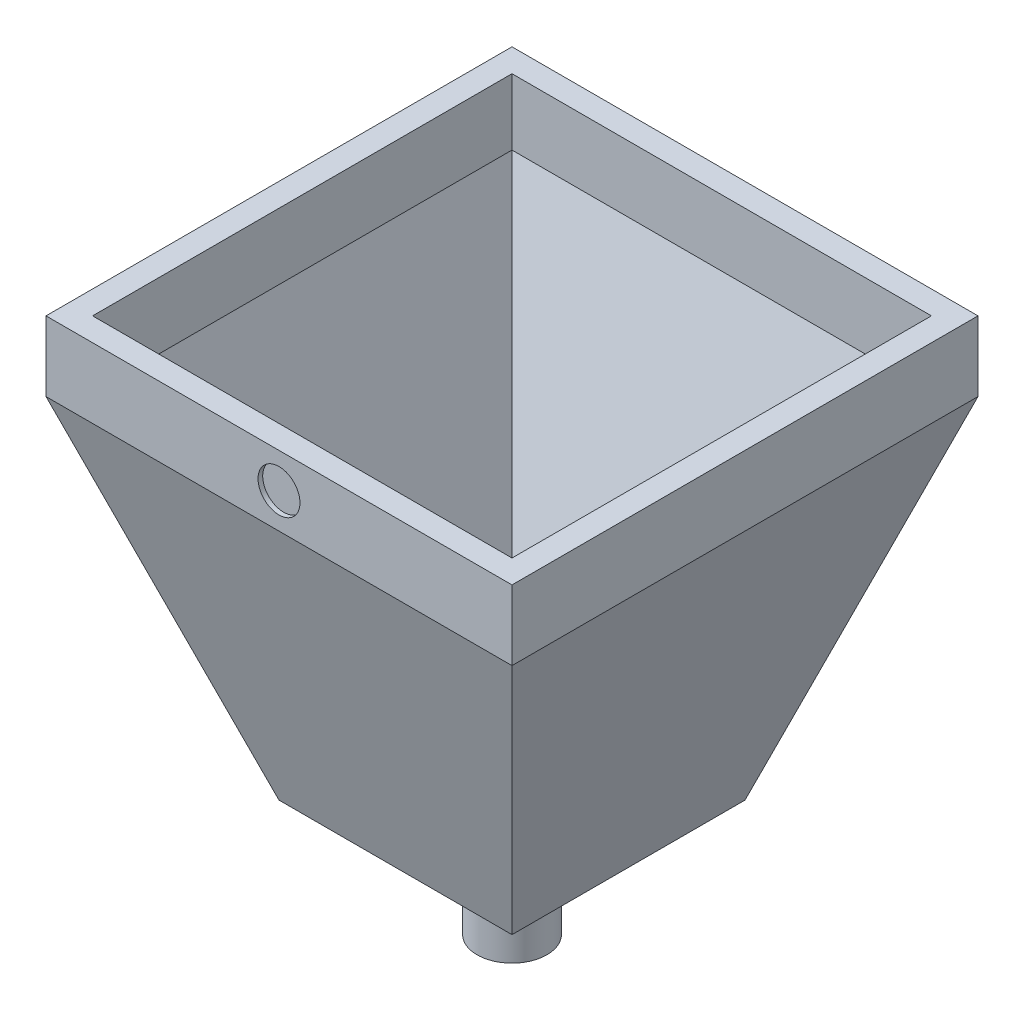
ISO-10303-21;
HEADER;
FILE_DESCRIPTION(('STEP AP214'),'2;1');
FILE_NAME('part.step','',(''),(''),'','','');
FILE_SCHEMA(('AUTOMOTIVE_DESIGN { 1 0 10303 214 1 1 1 1 }'));
ENDSEC;
DATA;
#1=APPLICATION_CONTEXT('core data for automotive mechanical design processes');
#2=APPLICATION_PROTOCOL_DEFINITION('international standard','automotive_design',2000,#1);
#3=PRODUCT_CONTEXT('',#1,'mechanical');
#4=PRODUCT('Part','Part','',(#3));
#5=PRODUCT_RELATED_PRODUCT_CATEGORY('part','',(#4));
#6=PRODUCT_DEFINITION_FORMATION('','',#4);
#7=PRODUCT_DEFINITION_CONTEXT('part definition',#1,'design');
#8=PRODUCT_DEFINITION('design','',#6,#7);
#9=PRODUCT_DEFINITION_SHAPE('','',#8);
#10=(LENGTH_UNIT() NAMED_UNIT(*) SI_UNIT(.MILLI.,.METRE.));
#11=(NAMED_UNIT(*) PLANE_ANGLE_UNIT() SI_UNIT($,.RADIAN.));
#12=(NAMED_UNIT(*) SI_UNIT($,.STERADIAN.) SOLID_ANGLE_UNIT());
#13=UNCERTAINTY_MEASURE_WITH_UNIT(LENGTH_MEASURE(1.E-05),#10,'distance_accuracy_value','');
#14=(GEOMETRIC_REPRESENTATION_CONTEXT(3) GLOBAL_UNCERTAINTY_ASSIGNED_CONTEXT((#13)) GLOBAL_UNIT_ASSIGNED_CONTEXT((#10,
#11,#12)) REPRESENTATION_CONTEXT('',''));
#15=CARTESIAN_POINT('',(0.,0.,0.));
#16=DIRECTION('',(0.,0.,1.));
#17=DIRECTION('',(1.,0.,0.));
#18=AXIS2_PLACEMENT_3D('',#15,#16,#17);
#19=CARTESIAN_POINT('',(0.,-5.,0.));
#20=DIRECTION('',(0.,1.,0.));
#21=DIRECTION('',(0.,0.,1.));
#22=AXIS2_PLACEMENT_3D('',#19,#20,#21);
#23=CYLINDRICAL_SURFACE('',#22,1.5);
#24=CARTESIAN_POINT('',(0.,-5.,0.));
#25=DIRECTION('',(0.,-1.,0.));
#26=DIRECTION('',(0.,0.,-1.));
#27=AXIS2_PLACEMENT_3D('',#24,#25,#26);
#28=CIRCLE('',#27,1.5);
#29=CARTESIAN_POINT('',(0.,-5.,-1.5));
#30=VERTEX_POINT('',#29);
#31=EDGE_CURVE('E13',#30,#30,#28,.T.);
#32=ORIENTED_EDGE('',*,*,#31,.F.);
#33=EDGE_LOOP('',(#32));
#34=FACE_BOUND('',#33,.T.);
#35=CARTESIAN_POINT('',(0.,0.,0.));
#36=DIRECTION('',(0.,-1.,0.));
#37=DIRECTION('',(0.,0.,-1.));
#38=AXIS2_PLACEMENT_3D('',#35,#36,#37);
#39=CIRCLE('',#38,1.5);
#40=CARTESIAN_POINT('',(0.,0.,-1.5));
#41=VERTEX_POINT('',#40);
#42=EDGE_CURVE('E64',#41,#41,#39,.T.);
#43=ORIENTED_EDGE('',*,*,#42,.T.);
#44=EDGE_LOOP('',(#43));
#45=FACE_BOUND('',#44,.T.);
#46=CARTESIAN_POINT('',(1.5,-1.43917780015329,0.));
#47=CARTESIAN_POINT('',(1.50000020822414,-1.43917752533704,0.0502423583340641));
#48=CARTESIAN_POINT('',(1.49745401376693,-1.44298478513104,0.100484543566457));
#49=CARTESIAN_POINT('',(1.48752326211906,-1.45797623220612,0.199366529015834));
#50=CARTESIAN_POINT('',(1.48013640790618,-1.46916392171494,0.248005556977501));
#51=CARTESIAN_POINT('',(1.46125241202354,-1.49823165881571,0.342106153927126));
#52=CARTESIAN_POINT('',(1.44977452746657,-1.51608037015726,0.387581436328778));
#53=CARTESIAN_POINT('',(1.4236306893872,-1.55770948178904,0.474707645498629));
#54=CARTESIAN_POINT('',(1.40896427302755,-1.58149074330357,0.516358015804834));
#55=CARTESIAN_POINT('',(1.37613664684919,-1.636506268837,0.598642350385054));
#56=CARTESIAN_POINT('',(1.3577844878966,-1.66820173052474,0.638890152730338));
#57=CARTESIAN_POINT('',(1.31991156541733,-1.73704282448251,0.713864022346369));
#58=CARTESIAN_POINT('',(1.30038915178416,-1.77419626507216,0.748582027719439));
#59=CARTESIAN_POINT('',(1.25864132339397,-1.85970398395962,0.81711148872748));
#60=CARTESIAN_POINT('',(1.23647533968899,-1.90890062675501,0.849915931813755));
#61=CARTESIAN_POINT('',(1.19542073676408,-2.01335948897656,0.906751785070868));
#62=CARTESIAN_POINT('',(1.17652647977327,-2.06861100093468,0.930798367132495));
#63=CARTESIAN_POINT('',(1.14988133320735,-2.16753344686409,0.963370175057203));
#64=CARTESIAN_POINT('',(1.14048813946218,-2.2099420265902,0.974372236180082));
#65=CARTESIAN_POINT('',(1.12628984829786,-2.29655005252416,0.9907530889261));
#66=CARTESIAN_POINT('',(1.12147684372013,-2.34074627451648,0.996141573259661));
#67=CARTESIAN_POINT('',(1.11718302804083,-2.42991518958136,1.00095682070629));
#68=CARTESIAN_POINT('',(1.11772401279478,-2.47489031187889,1.0003592145882));
#69=CARTESIAN_POINT('',(1.12409887741485,-2.56399528690377,0.993187906666195));
#70=CARTESIAN_POINT('',(1.12993724142592,-2.6081243911696,0.986609141899784));
#71=CARTESIAN_POINT('',(1.14563592995791,-2.69241132577208,0.968324971088712));
#72=CARTESIAN_POINT('',(1.15530744165153,-2.73265846811481,0.956858557405003));
#73=CARTESIAN_POINT('',(1.17754811463845,-2.81068964564904,0.929350592909502));
#74=CARTESIAN_POINT('',(1.19011822916388,-2.84847286530192,0.913307536614355));
#75=CARTESIAN_POINT('',(1.21982098202212,-2.92869049779443,0.873369093698319));
#76=CARTESIAN_POINT('',(1.23736158924507,-2.97050775024735,0.848540261643843));
#77=CARTESIAN_POINT('',(1.27345768922483,-3.04986949764519,0.793344802336529));
#78=CARTESIAN_POINT('',(1.29201441370947,-3.08740862899042,0.762971345040338));
#79=CARTESIAN_POINT('',(1.33271671862096,-3.16544907300885,0.689905826559711));
#80=CARTESIAN_POINT('',(1.35477372355024,-3.20484482450899,0.645969691404499));
#81=CARTESIAN_POINT('',(1.39609050337857,-3.27577604740822,0.55100399955381));
#82=CARTESIAN_POINT('',(1.41535288825285,-3.30731887285433,0.499981149675163));
#83=CARTESIAN_POINT('',(1.44572702044166,-3.35591665946749,0.402428913545601));
#84=CARTESIAN_POINT('',(1.45769630582498,-3.3745994818235,0.356978821685242));
#85=CARTESIAN_POINT('',(1.47753859515521,-3.40523026296523,0.263018021968455));
#86=CARTESIAN_POINT('',(1.48541506063844,-3.4171839137192,0.214509939501018));
#87=CARTESIAN_POINT('',(1.49637941078331,-3.43375838277248,0.115492726585947));
#88=CARTESIAN_POINT('',(1.49944661230576,-3.43834753062247,0.0649759059670237));
#89=CARTESIAN_POINT('',(1.50041557482591,-3.43980134443434,-0.0362207596946167));
#90=CARTESIAN_POINT('',(1.49831769692815,-3.43666655039768,-0.0869005930932817));
#91=CARTESIAN_POINT('',(1.48949794712138,-3.42336577237231,-0.183227858602147));
#92=CARTESIAN_POINT('',(1.48311123195135,-3.41370915127563,-0.228978722339655));
#93=CARTESIAN_POINT('',(1.46659224642396,-3.38837995714691,-0.31805819621364));
#94=CARTESIAN_POINT('',(1.45645937873408,-3.37270642468939,-0.361386418785355));
#95=CARTESIAN_POINT('',(1.4324817626467,-3.33485165163061,-0.447332375233221));
#96=CARTESIAN_POINT('',(1.41844935068245,-3.31233372311153,-0.489748092316564));
#97=CARTESIAN_POINT('',(1.38800927805403,-3.26196115518099,-0.57034151197779));
#98=CARTESIAN_POINT('',(1.37160015200652,-3.23410321989032,-0.608516574097255));
#99=CARTESIAN_POINT('',(1.33477273328243,-3.16887386607092,-0.685927227415323));
#100=CARTESIAN_POINT('',(1.31413078406203,-3.13069467010127,-0.724375937862665));
#101=CARTESIAN_POINT('',(1.27285586536854,-3.04862208518922,-0.794669840332393));
#102=CARTESIAN_POINT('',(1.25222291185946,-3.00472478065389,-0.826510468230433));
#103=CARTESIAN_POINT('',(1.21469839506517,-2.91560659372409,-0.880623882794763));
#104=CARTESIAN_POINT('',(1.19763798588662,-2.87081178325343,-0.903478180804394));
#105=CARTESIAN_POINT('',(1.16719487207113,-2.77724147376272,-0.942481068876251));
#106=CARTESIAN_POINT('',(1.1538055628277,-2.72847333095559,-0.958641728453858));
#107=CARTESIAN_POINT('',(1.13466604076532,-2.63689555658624,-0.981179217293119));
#108=CARTESIAN_POINT('',(1.12797499006895,-2.59459189522382,-0.988792987823092));
#109=CARTESIAN_POINT('',(1.11939733222928,-2.50889115948557,-0.998496029624887));
#110=CARTESIAN_POINT('',(1.11750550674066,-2.46549532458006,-1.00059130142516));
#111=CARTESIAN_POINT('',(1.11882100574833,-2.37885627179493,-0.999119609907757));
#112=CARTESIAN_POINT('',(1.12203134956834,-2.33561315947183,-0.995549293852656));
#113=CARTESIAN_POINT('',(1.1330522619864,-2.25050603588181,-0.982984986109971));
#114=CARTESIAN_POINT('',(1.14086896751217,-2.2086439432229,-0.97398375858765));
#115=CARTESIAN_POINT('',(1.1626342196827,-2.11632220693897,-0.947965178356308));
#116=CARTESIAN_POINT('',(1.17766166854602,-2.06654394378376,-0.929450935941994));
#117=CARTESIAN_POINT('',(1.21111080629161,-1.97143438306388,-0.885422631474874));
#118=CARTESIAN_POINT('',(1.22953724861882,-1.92610945118486,-0.859898741785421));
#119=CARTESIAN_POINT('',(1.26808593269726,-1.83953685655645,-0.801991402694657));
#120=CARTESIAN_POINT('',(1.28823293691071,-1.79837842743403,-0.769491549448272));
#121=CARTESIAN_POINT('',(1.32814150773993,-1.72151656103206,-0.698358840177309));
#122=CARTESIAN_POINT('',(1.3479029541764,-1.68581480164088,-0.659724105134951));
#123=CARTESIAN_POINT('',(1.38815775980392,-1.61582174799623,-0.570728664877768));
#124=CARTESIAN_POINT('',(1.40834902724558,-1.58246848006346,-0.519480834775987));
#125=CARTESIAN_POINT('',(1.44388832937518,-1.5252211618213,-0.410434277887489));
#126=CARTESIAN_POINT('',(1.45924396722731,-1.50131224674147,-0.352646031225022));
#127=CARTESIAN_POINT('',(1.48050822418367,-1.46860051107127,-0.245717534917525));
#128=CARTESIAN_POINT('',(1.48775740184446,-1.45762228060395,-0.197506162628867));
#129=CARTESIAN_POINT('',(1.49750140070948,-1.44291378388427,-0.0995290060120655));
#130=CARTESIAN_POINT('',(1.49999979375663,-1.43917807235529,-0.0497644180940288));
#131=CARTESIAN_POINT('',(1.5,-1.43917780015329,0.));
#132=B_SPLINE_CURVE_WITH_KNOTS('',3,(#46,#47,#48,#49,#50,#51,#52,#53,#54,#55,#56,#57,#58,#59,
#60,#61,#62,#63,#64,#65,#66,#67,#68,#69,#70,#71,#72,#73,#74,#75,#76,#77,#78,#79,#80,#81,#82,#83,
#84,#85,#86,#87,#88,#89,#90,#91,#92,#93,#94,#95,#96,#97,#98,#99,#100,#101,#102,#103,#104,#105,
#106,#107,#108,#109,#110,#111,#112,#113,#114,#115,#116,#117,#118,#119,#120,#121,#122,#123,#124,
#125,#126,#127,#128,#129,#130,#131),.UNSPECIFIED.,.T.,.F.,(4,2,2,2,2,2,2,2,2,2,2,2,2,2,2,2,2,2,
2,2,2,2,2,2,2,2,2,2,2,2,2,2,2,2,2,2,2,2,2,2,2,2,4),(0.,0.1505266132527,0.301124707174344,
0.451023076595116,0.600943219336932,0.763585145002784,0.926462058021593,1.11503341647991,
1.30327652722719,1.43716846838015,1.57082883922904,1.70503355867689,1.83935198631676,
1.96774431099011,2.09617891902539,2.25073787329797,2.40548851889212,2.5935947724756,
2.78152420149865,2.93262043847563,3.0835886757059,3.23520441646309,3.38680955765891,
3.5277654239542,3.66874377568319,3.81826173413942,3.96787227471786,4.1411408806983,
4.31452876587063,4.473249676497,4.63168313315305,4.76162024003011,4.8914160016149,
5.02128860137217,5.15133461921144,5.31603304346011,5.48096356682587,5.64889622595852,
5.81688041978686,6.00897675773024,6.20076953274023,6.34997645676982,6.49907115623394),.UNSPECIFIED.);
#133=CARTESIAN_POINT('',(1.5,-1.43917780015329,0.));
#134=VERTEX_POINT('',#133);
#135=CARTESIAN_POINT('',(1.5,-3.43917780015329,0.));
#136=VERTEX_POINT('',#135);
#137=EDGE_CURVE('E73',#134,#136,#132,.T.);
#138=ORIENTED_EDGE('',*,*,#137,.F.);
#139=EDGE_CURVE('E71',#136,#134,#132,.T.);
#140=ORIENTED_EDGE('',*,*,#139,.F.);
#141=EDGE_LOOP('',(#138,#140));
#142=FACE_BOUND('',#141,.T.);
#143=ADVANCED_FACE('F55',(#34,#45,#142),#23,.T.);
#144=CARTESIAN_POINT('',(0.,-5.,0.));
#145=DIRECTION('',(0.,-1.,0.));
#146=DIRECTION('',(0.,0.,-1.));
#147=AXIS2_PLACEMENT_3D('',#144,#145,#146);
#148=PLANE('',#147);
#149=CARTESIAN_POINT('',(0.,-5.,0.));
#150=DIRECTION('',(0.,-1.,0.));
#151=DIRECTION('',(0.,0.,-1.));
#152=AXIS2_PLACEMENT_3D('',#149,#150,#151);
#153=CIRCLE('',#152,1.40639171905491);
#154=CARTESIAN_POINT('',(0.,-5.,-1.40639171905491));
#155=VERTEX_POINT('',#154);
#156=EDGE_CURVE('E86',#155,#155,#153,.F.);
#157=ORIENTED_EDGE('',*,*,#156,.T.);
#158=EDGE_LOOP('',(#157));
#159=FACE_BOUND('',#158,.T.);
#160=ORIENTED_EDGE('',*,*,#31,.T.);
#161=EDGE_LOOP('',(#160));
#162=FACE_BOUND('',#161,.T.);
#163=ADVANCED_FACE('F98',(#159,#162),#148,.T.);
#164=CARTESIAN_POINT('',(0.,0.,0.));
#165=DIRECTION('',(0.,-1.,0.));
#166=DIRECTION('',(0.,0.,-1.));
#167=AXIS2_PLACEMENT_3D('',#164,#165,#166);
#168=PLANE('',#167);
#169=CARTESIAN_POINT('',(0.,0.,0.));
#170=DIRECTION('',(0.,-1.,0.));
#171=DIRECTION('',(0.,0.,-1.));
#172=AXIS2_PLACEMENT_3D('',#169,#170,#171);
#173=CIRCLE('',#172,1.40639171905491);
#174=CARTESIAN_POINT('',(0.,0.,-1.40639171905491));
#175=VERTEX_POINT('',#174);
#176=EDGE_CURVE('E59',#175,#175,#173,.F.);
#177=ORIENTED_EDGE('',*,*,#176,.F.);
#178=EDGE_LOOP('',(#177));
#179=FACE_BOUND('',#178,.T.);
#180=ORIENTED_EDGE('',*,*,#42,.F.);
#181=EDGE_LOOP('',(#180));
#182=FACE_BOUND('',#181,.T.);
#183=ADVANCED_FACE('F100',(#179,#182),#168,.F.);
#184=CARTESIAN_POINT('',(1.5,-2.43917780015329,0.));
#185=DIRECTION('',(1.,0.,0.));
#186=DIRECTION('',(0.,0.,-1.));
#187=AXIS2_PLACEMENT_3D('',#184,#185,#186);
#188=PLANE('',#187);
#189=CARTESIAN_POINT('',(1.5,-2.43917780015329,0.));
#190=DIRECTION('',(1.,0.,0.));
#191=DIRECTION('',(0.,0.,-1.));
#192=AXIS2_PLACEMENT_3D('',#189,#190,#191);
#193=CIRCLE('',#192,1.);
#194=EDGE_CURVE('E81',#136,#134,#193,.T.);
#195=ORIENTED_EDGE('',*,*,#194,.T.);
#196=EDGE_CURVE('E83',#134,#136,#193,.T.);
#197=ORIENTED_EDGE('',*,*,#196,.T.);
#198=EDGE_LOOP('',(#195,#197));
#199=FACE_BOUND('',#198,.T.);
#200=ADVANCED_FACE('F85',(#199),#188,.T.);
#201=CARTESIAN_POINT('',(1.5,-2.43917780015329,0.));
#202=DIRECTION('',(-1.,0.,0.));
#203=DIRECTION('',(0.,0.,1.));
#204=AXIS2_PLACEMENT_3D('',#201,#202,#203);
#205=CYLINDRICAL_SURFACE('',#204,1.);
#206=ORIENTED_EDGE('',*,*,#196,.F.);
#207=ORIENTED_EDGE('',*,*,#137,.T.);
#208=EDGE_LOOP('',(#206,#207));
#209=FACE_BOUND('',#208,.T.);
#210=ADVANCED_FACE('F88',(#209),#205,.T.);
#211=ORIENTED_EDGE('',*,*,#194,.F.);
#212=ORIENTED_EDGE('',*,*,#139,.T.);
#213=EDGE_LOOP('',(#211,#212));
#214=FACE_BOUND('',#213,.T.);
#215=ADVANCED_FACE('F80',(#214),#205,.T.);
#216=CARTESIAN_POINT('',(0.,-31.5,0.));
#217=DIRECTION('',(0.,1.,0.));
#218=DIRECTION('',(0.,0.,1.));
#219=AXIS2_PLACEMENT_3D('',#216,#217,#218);
#220=CYLINDRICAL_SURFACE('',#219,1.40639171905491);
#221=ORIENTED_EDGE('',*,*,#156,.F.);
#222=EDGE_LOOP('',(#221));
#223=FACE_BOUND('',#222,.T.);
#224=ORIENTED_EDGE('',*,*,#176,.T.);
#225=EDGE_LOOP('',(#224));
#226=FACE_BOUND('',#225,.T.);
#227=ADVANCED_FACE('F137',(#223,#226),#220,.F.);
#228=CLOSED_SHELL('',(#143,#163,#183,#200,#210,#215,#227));
#229=MANIFOLD_SOLID_BREP('B2',#228);
#230=CARTESIAN_POINT('',(0.,0.,0.));
#231=DIRECTION('',(0.,-1.,0.));
#232=DIRECTION('',(0.,0.,-1.));
#233=AXIS2_PLACEMENT_3D('',#230,#231,#232);
#234=PLANE('',#233);
#235=CARTESIAN_POINT('',(0.,0.,0.));
#236=DIRECTION('',(0.,-1.,0.));
#237=DIRECTION('',(0.,0.,-1.));
#238=AXIS2_PLACEMENT_3D('',#235,#236,#237);
#239=CIRCLE('',#238,1.5);
#240=CARTESIAN_POINT('',(0.,0.,-1.5));
#241=VERTEX_POINT('',#240);
#242=EDGE_CURVE('E640',#241,#241,#239,.T.);
#243=ORIENTED_EDGE('',*,*,#242,.F.);
#244=EDGE_LOOP('',(#243));
#245=FACE_BOUND('',#244,.T.);
#246=DIRECTION('',(0.,0.,-1.));
#247=VECTOR('',#246,1.);
#248=CARTESIAN_POINT('',(5.,0.,5.));
#249=LINE('',#248,#247);
#250=CARTESIAN_POINT('',(5.,0.,5.));
#251=VERTEX_POINT('',#250);
#252=CARTESIAN_POINT('',(5.,0.,-5.));
#253=VERTEX_POINT('',#252);
#254=EDGE_CURVE('E396',#251,#253,#249,.T.);
#255=ORIENTED_EDGE('',*,*,#254,.F.);
#256=DIRECTION('',(1.,0.,0.));
#257=VECTOR('',#256,1.);
#258=CARTESIAN_POINT('',(-5.,0.,5.));
#259=LINE('',#258,#257);
#260=CARTESIAN_POINT('',(-5.,0.,5.));
#261=VERTEX_POINT('',#260);
#262=EDGE_CURVE('E53',#261,#251,#259,.T.);
#263=ORIENTED_EDGE('',*,*,#262,.F.);
#264=DIRECTION('',(0.,0.,1.));
#265=VECTOR('',#264,1.);
#266=CARTESIAN_POINT('',(-5.,0.,5.));
#267=LINE('',#266,#265);
#268=CARTESIAN_POINT('',(-5.,0.,-5.));
#269=VERTEX_POINT('',#268);
#270=EDGE_CURVE('E176',#269,#261,#267,.T.);
#271=ORIENTED_EDGE('',*,*,#270,.F.);
#272=DIRECTION('',(-1.,0.,0.));
#273=VECTOR('',#272,1.);
#274=CARTESIAN_POINT('',(-5.,0.,-5.));
#275=LINE('',#274,#273);
#276=EDGE_CURVE('E384',#253,#269,#275,.T.);
#277=ORIENTED_EDGE('',*,*,#276,.F.);
#278=EDGE_LOOP('',(#255,#263,#271,#277));
#279=FACE_BOUND('',#278,.T.);
#280=ADVANCED_FACE('F167',(#245,#279),#234,.T.);
#281=CARTESIAN_POINT('',(-4.5,-1.5,0.));
#282=DIRECTION('',(-0.948683298050514,-0.316227766016838,0.));
#283=DIRECTION('',(0.316227766016838,-0.948683298050514,0.));
#284=AXIS2_PLACEMENT_3D('',#281,#282,#283);
#285=PLANE('',#284);
#286=DIRECTION('',(0.301511344577764,-0.904534033733291,0.301511344577763));
#287=VECTOR('',#286,1.);
#288=CARTESIAN_POINT('',(-10.,15.,-10.));
#289=LINE('',#288,#287);
#290=CARTESIAN_POINT('',(-10.,15.,-10.));
#291=VERTEX_POINT('',#290);
#292=EDGE_CURVE('E440',#291,#269,#289,.T.);
#293=ORIENTED_EDGE('',*,*,#292,.T.);
#294=ORIENTED_EDGE('',*,*,#270,.T.);
#295=DIRECTION('',(0.301511344577764,-0.904534033733291,-0.301511344577764));
#296=VECTOR('',#295,1.);
#297=CARTESIAN_POINT('',(-10.,15.,10.));
#298=LINE('',#297,#296);
#299=CARTESIAN_POINT('',(-10.,15.,10.));
#300=VERTEX_POINT('',#299);
#301=EDGE_CURVE('E338',#300,#261,#298,.T.);
#302=ORIENTED_EDGE('',*,*,#301,.F.);
#303=DIRECTION('',(0.,0.,1.));
#304=VECTOR('',#303,1.);
#305=CARTESIAN_POINT('',(-10.,15.,10.));
#306=LINE('',#305,#304);
#307=EDGE_CURVE('E452',#291,#300,#306,.T.);
#308=ORIENTED_EDGE('',*,*,#307,.F.);
#309=EDGE_LOOP('',(#293,#294,#302,#308));
#310=FACE_BOUND('',#309,.T.);
#311=ADVANCED_FACE('F351',(#310),#285,.T.);
#312=CARTESIAN_POINT('',(0.,-1.5,4.5));
#313=DIRECTION('',(0.,-0.316227766016838,0.948683298050514));
#314=DIRECTION('',(0.,-0.948683298050514,-0.316227766016838));
#315=AXIS2_PLACEMENT_3D('',#312,#313,#314);
#316=PLANE('',#315);
#317=ORIENTED_EDGE('',*,*,#301,.T.);
#318=ORIENTED_EDGE('',*,*,#262,.T.);
#319=DIRECTION('',(-0.301511344577763,-0.904534033733291,-0.301511344577764));
#320=VECTOR('',#319,1.);
#321=CARTESIAN_POINT('',(10.,15.,10.));
#322=LINE('',#321,#320);
#323=CARTESIAN_POINT('',(10.,15.,10.));
#324=VERTEX_POINT('',#323);
#325=EDGE_CURVE('E192',#324,#251,#322,.T.);
#326=ORIENTED_EDGE('',*,*,#325,.F.);
#327=DIRECTION('',(1.,0.,0.));
#328=VECTOR('',#327,1.);
#329=CARTESIAN_POINT('',(-10.,15.,10.));
#330=LINE('',#329,#328);
#331=EDGE_CURVE('E332',#300,#324,#330,.T.);
#332=ORIENTED_EDGE('',*,*,#331,.F.);
#333=EDGE_LOOP('',(#317,#318,#326,#332));
#334=FACE_BOUND('',#333,.T.);
#335=ADVANCED_FACE('F340',(#334),#316,.T.);
#336=CARTESIAN_POINT('',(0.,-1.5,-4.5));
#337=DIRECTION('',(0.,-0.316227766016838,-0.948683298050514));
#338=DIRECTION('',(0.,0.948683298050514,-0.316227766016838));
#339=AXIS2_PLACEMENT_3D('',#336,#337,#338);
#340=PLANE('',#339);
#341=DIRECTION('',(-0.301511344577763,-0.904534033733291,0.301511344577764));
#342=VECTOR('',#341,1.);
#343=CARTESIAN_POINT('',(10.,15.,-10.));
#344=LINE('',#343,#342);
#345=CARTESIAN_POINT('',(10.,15.,-10.));
#346=VERTEX_POINT('',#345);
#347=EDGE_CURVE('E425',#346,#253,#344,.T.);
#348=ORIENTED_EDGE('',*,*,#347,.T.);
#349=ORIENTED_EDGE('',*,*,#276,.T.);
#350=ORIENTED_EDGE('',*,*,#292,.F.);
#351=DIRECTION('',(-1.,0.,0.));
#352=VECTOR('',#351,1.);
#353=CARTESIAN_POINT('',(-10.,15.,-10.));
#354=LINE('',#353,#352);
#355=EDGE_CURVE('E437',#346,#291,#354,.T.);
#356=ORIENTED_EDGE('',*,*,#355,.F.);
#357=EDGE_LOOP('',(#348,#349,#350,#356));
#358=FACE_BOUND('',#357,.T.);
#359=ADVANCED_FACE('F350',(#358),#340,.T.);
#360=CARTESIAN_POINT('',(4.5,-1.5,0.));
#361=DIRECTION('',(0.948683298050514,-0.316227766016838,0.));
#362=DIRECTION('',(0.316227766016838,0.948683298050514,0.));
#363=AXIS2_PLACEMENT_3D('',#360,#361,#362);
#364=PLANE('',#363);
#365=ORIENTED_EDGE('',*,*,#325,.T.);
#366=ORIENTED_EDGE('',*,*,#254,.T.);
#367=ORIENTED_EDGE('',*,*,#347,.F.);
#368=DIRECTION('',(0.,0.,-1.));
#369=VECTOR('',#368,1.);
#370=CARTESIAN_POINT('',(10.,15.,10.));
#371=LINE('',#370,#369);
#372=EDGE_CURVE('E422',#324,#346,#371,.T.);
#373=ORIENTED_EDGE('',*,*,#372,.F.);
#374=EDGE_LOOP('',(#365,#366,#367,#373));
#375=FACE_BOUND('',#374,.T.);
#376=ADVANCED_FACE('F402',(#375),#364,.T.);
#377=CARTESIAN_POINT('',(-10.,18.,10.));
#378=DIRECTION('',(1.,0.,0.));
#379=DIRECTION('',(0.,0.,-1.));
#380=AXIS2_PLACEMENT_3D('',#377,#378,#379);
#381=PLANE('',#380);
#382=ORIENTED_EDGE('',*,*,#307,.T.);
#383=DIRECTION('',(0.,-1.,0.));
#384=VECTOR('',#383,1.);
#385=CARTESIAN_POINT('',(-10.,18.,10.));
#386=LINE('',#385,#384);
#387=CARTESIAN_POINT('',(-10.,18.,10.));
#388=VERTEX_POINT('',#387);
#389=EDGE_CURVE('E502',#388,#300,#386,.T.);
#390=ORIENTED_EDGE('',*,*,#389,.F.);
#391=DIRECTION('',(0.,0.,1.));
#392=VECTOR('',#391,1.);
#393=CARTESIAN_POINT('',(-10.,18.,10.));
#394=LINE('',#393,#392);
#395=CARTESIAN_POINT('',(-10.,18.,-10.));
#396=VERTEX_POINT('',#395);
#397=EDGE_CURVE('E268',#396,#388,#394,.T.);
#398=ORIENTED_EDGE('',*,*,#397,.F.);
#399=DIRECTION('',(0.,-1.,0.));
#400=VECTOR('',#399,1.);
#401=CARTESIAN_POINT('',(-10.,18.,-10.));
#402=LINE('',#401,#400);
#403=EDGE_CURVE('E326',#396,#291,#402,.T.);
#404=ORIENTED_EDGE('',*,*,#403,.T.);
#405=EDGE_LOOP('',(#382,#390,#398,#404));
#406=FACE_BOUND('',#405,.T.);
#407=ADVANCED_FACE('F410',(#406),#381,.F.);
#408=CARTESIAN_POINT('',(10.,18.,10.));
#409=DIRECTION('',(0.,0.,-1.));
#410=DIRECTION('',(-1.,0.,0.));
#411=AXIS2_PLACEMENT_3D('',#408,#409,#410);
#412=PLANE('',#411);
#413=CARTESIAN_POINT('',(0.,16.5,10.));
#414=DIRECTION('',(0.,0.,1.));
#415=DIRECTION('',(1.,0.,0.));
#416=AXIS2_PLACEMENT_3D('',#413,#414,#415);
#417=CIRCLE('',#416,0.9);
#418=CARTESIAN_POINT('',(0.9,16.5,10.));
#419=VERTEX_POINT('',#418);
#420=EDGE_CURVE('E812',#419,#419,#417,.T.);
#421=ORIENTED_EDGE('',*,*,#420,.F.);
#422=EDGE_LOOP('',(#421));
#423=FACE_BOUND('',#422,.T.);
#424=ORIENTED_EDGE('',*,*,#331,.T.);
#425=DIRECTION('',(0.,-1.,0.));
#426=VECTOR('',#425,1.);
#427=CARTESIAN_POINT('',(10.,18.,10.));
#428=LINE('',#427,#426);
#429=CARTESIAN_POINT('',(10.,18.,10.));
#430=VERTEX_POINT('',#429);
#431=EDGE_CURVE('E494',#430,#324,#428,.T.);
#432=ORIENTED_EDGE('',*,*,#431,.F.);
#433=DIRECTION('',(1.,0.,0.));
#434=VECTOR('',#433,1.);
#435=CARTESIAN_POINT('',(10.,18.,10.));
#436=LINE('',#435,#434);
#437=EDGE_CURVE('E320',#388,#430,#436,.T.);
#438=ORIENTED_EDGE('',*,*,#437,.F.);
#439=ORIENTED_EDGE('',*,*,#389,.T.);
#440=EDGE_LOOP('',(#424,#432,#438,#439));
#441=FACE_BOUND('',#440,.T.);
#442=ADVANCED_FACE('F514',(#423,#441),#412,.F.);
#443=CARTESIAN_POINT('',(10.,18.,10.));
#444=DIRECTION('',(-1.,0.,0.));
#445=DIRECTION('',(0.,0.,1.));
#446=AXIS2_PLACEMENT_3D('',#443,#444,#445);
#447=PLANE('',#446);
#448=ORIENTED_EDGE('',*,*,#372,.T.);
#449=DIRECTION('',(0.,-1.,0.));
#450=VECTOR('',#449,1.);
#451=CARTESIAN_POINT('',(10.,18.,-10.));
#452=LINE('',#451,#450);
#453=CARTESIAN_POINT('',(10.,18.,-10.));
#454=VERTEX_POINT('',#453);
#455=EDGE_CURVE('E503',#454,#346,#452,.T.);
#456=ORIENTED_EDGE('',*,*,#455,.F.);
#457=DIRECTION('',(0.,0.,-1.));
#458=VECTOR('',#457,1.);
#459=CARTESIAN_POINT('',(10.,18.,10.));
#460=LINE('',#459,#458);
#461=EDGE_CURVE('E322',#430,#454,#460,.T.);
#462=ORIENTED_EDGE('',*,*,#461,.F.);
#463=ORIENTED_EDGE('',*,*,#431,.T.);
#464=EDGE_LOOP('',(#448,#456,#462,#463));
#465=FACE_BOUND('',#464,.T.);
#466=ADVANCED_FACE('F523',(#465),#447,.F.);
#467=CARTESIAN_POINT('',(10.,18.,-10.));
#468=DIRECTION('',(0.,0.,1.));
#469=DIRECTION('',(1.,0.,0.));
#470=AXIS2_PLACEMENT_3D('',#467,#468,#469);
#471=PLANE('',#470);
#472=CARTESIAN_POINT('',(0.,16.5,-10.));
#473=DIRECTION('',(0.,0.,-1.));
#474=DIRECTION('',(-1.,0.,0.));
#475=AXIS2_PLACEMENT_3D('',#472,#473,#474);
#476=CIRCLE('',#475,0.9);
#477=CARTESIAN_POINT('',(-0.9,16.5,-10.));
#478=VERTEX_POINT('',#477);
#479=EDGE_CURVE('E645',#478,#478,#476,.T.);
#480=ORIENTED_EDGE('',*,*,#479,.F.);
#481=EDGE_LOOP('',(#480));
#482=FACE_BOUND('',#481,.T.);
#483=ORIENTED_EDGE('',*,*,#355,.T.);
#484=ORIENTED_EDGE('',*,*,#403,.F.);
#485=DIRECTION('',(-1.,0.,0.));
#486=VECTOR('',#485,1.);
#487=CARTESIAN_POINT('',(10.,18.,-10.));
#488=LINE('',#487,#486);
#489=EDGE_CURVE('E324',#454,#396,#488,.T.);
#490=ORIENTED_EDGE('',*,*,#489,.F.);
#491=ORIENTED_EDGE('',*,*,#455,.T.);
#492=EDGE_LOOP('',(#483,#484,#490,#491));
#493=FACE_BOUND('',#492,.T.);
#494=ADVANCED_FACE('F567',(#482,#493),#471,.F.);
#495=CARTESIAN_POINT('',(0.,18.,0.));
#496=DIRECTION('',(0.,1.,0.));
#497=DIRECTION('',(0.,0.,1.));
#498=AXIS2_PLACEMENT_3D('',#495,#496,#497);
#499=PLANE('',#498);
#500=DIRECTION('',(0.,0.,1.));
#501=VECTOR('',#500,1.);
#502=CARTESIAN_POINT('',(-9.,18.,10.));
#503=LINE('',#502,#501);
#504=CARTESIAN_POINT('',(-9.,18.,-9.));
#505=VERTEX_POINT('',#504);
#506=CARTESIAN_POINT('',(-9.,18.,9.));
#507=VERTEX_POINT('',#506);
#508=EDGE_CURVE('E311',#505,#507,#503,.T.);
#509=ORIENTED_EDGE('',*,*,#508,.F.);
#510=DIRECTION('',(-1.,0.,0.));
#511=VECTOR('',#510,1.);
#512=CARTESIAN_POINT('',(10.,18.,-9.));
#513=LINE('',#512,#511);
#514=CARTESIAN_POINT('',(9.,18.,-9.));
#515=VERTEX_POINT('',#514);
#516=EDGE_CURVE('E307',#515,#505,#513,.T.);
#517=ORIENTED_EDGE('',*,*,#516,.F.);
#518=DIRECTION('',(0.,0.,-1.));
#519=VECTOR('',#518,1.);
#520=CARTESIAN_POINT('',(9.,18.,10.));
#521=LINE('',#520,#519);
#522=CARTESIAN_POINT('',(9.,18.,9.));
#523=VERTEX_POINT('',#522);
#524=EDGE_CURVE('E315',#523,#515,#521,.T.);
#525=ORIENTED_EDGE('',*,*,#524,.F.);
#526=DIRECTION('',(1.,0.,0.));
#527=VECTOR('',#526,1.);
#528=CARTESIAN_POINT('',(10.,18.,9.));
#529=LINE('',#528,#527);
#530=EDGE_CURVE('E313',#507,#523,#529,.T.);
#531=ORIENTED_EDGE('',*,*,#530,.F.);
#532=EDGE_LOOP('',(#509,#517,#525,#531));
#533=FACE_BOUND('',#532,.T.);
#534=ORIENTED_EDGE('',*,*,#397,.T.);
#535=ORIENTED_EDGE('',*,*,#437,.T.);
#536=ORIENTED_EDGE('',*,*,#461,.T.);
#537=ORIENTED_EDGE('',*,*,#489,.T.);
#538=EDGE_LOOP('',(#534,#535,#536,#537));
#539=FACE_BOUND('',#538,.T.);
#540=ADVANCED_FACE('F576',(#533,#539),#499,.T.);
#541=CARTESIAN_POINT('',(0.,1.,0.));
#542=DIRECTION('',(0.,-1.,0.));
#543=DIRECTION('',(0.,0.,-1.));
#544=AXIS2_PLACEMENT_3D('',#541,#542,#543);
#545=PLANE('',#544);
#546=CARTESIAN_POINT('',(0.,1.,0.));
#547=DIRECTION('',(0.,-1.,0.));
#548=DIRECTION('',(0.,0.,-1.));
#549=AXIS2_PLACEMENT_3D('',#546,#547,#548);
#550=CIRCLE('',#549,1.5);
#551=CARTESIAN_POINT('',(0.,1.,-1.5));
#552=VERTEX_POINT('',#551);
#553=EDGE_CURVE('E171',#552,#552,#550,.T.);
#554=ORIENTED_EDGE('',*,*,#553,.T.);
#555=EDGE_LOOP('',(#554));
#556=FACE_BOUND('',#555,.T.);
#557=DIRECTION('',(0.,0.,-1.));
#558=VECTOR('',#557,1.);
#559=CARTESIAN_POINT('',(4.27924077994388,1.,0.));
#560=LINE('',#559,#558);
#561=CARTESIAN_POINT('',(4.27924077994388,1.,4.27924077994387));
#562=VERTEX_POINT('',#561);
#563=CARTESIAN_POINT('',(4.27924077994388,1.,-4.27924077994387));
#564=VERTEX_POINT('',#563);
#565=EDGE_CURVE('E293',#562,#564,#560,.T.);
#566=ORIENTED_EDGE('',*,*,#565,.T.);
#567=DIRECTION('',(-1.,0.,0.));
#568=VECTOR('',#567,1.);
#569=CARTESIAN_POINT('',(0.,1.,-4.27924077994387));
#570=LINE('',#569,#568);
#571=CARTESIAN_POINT('',(-4.27924077994387,1.,-4.27924077994387));
#572=VERTEX_POINT('',#571);
#573=EDGE_CURVE('E273',#564,#572,#570,.T.);
#574=ORIENTED_EDGE('',*,*,#573,.T.);
#575=DIRECTION('',(0.,0.,1.));
#576=VECTOR('',#575,1.);
#577=CARTESIAN_POINT('',(-4.27924077994387,1.,0.));
#578=LINE('',#577,#576);
#579=CARTESIAN_POINT('',(-4.27924077994387,1.,4.27924077994387));
#580=VERTEX_POINT('',#579);
#581=EDGE_CURVE('E269',#572,#580,#578,.T.);
#582=ORIENTED_EDGE('',*,*,#581,.T.);
#583=DIRECTION('',(1.,0.,0.));
#584=VECTOR('',#583,1.);
#585=CARTESIAN_POINT('',(0.,1.,4.27924077994387));
#586=LINE('',#585,#584);
#587=EDGE_CURVE('E257',#580,#562,#586,.T.);
#588=ORIENTED_EDGE('',*,*,#587,.T.);
#589=EDGE_LOOP('',(#566,#574,#582,#588));
#590=FACE_BOUND('',#589,.T.);
#591=ADVANCED_FACE('F272',(#556,#590),#545,.F.);
#592=CARTESIAN_POINT('',(-3.55131670194948,-1.18377223398316,0.));
#593=DIRECTION('',(-0.948683298050514,-0.316227766016838,0.));
#594=DIRECTION('',(0.316227766016838,-0.948683298050514,0.));
#595=AXIS2_PLACEMENT_3D('',#592,#593,#594);
#596=PLANE('',#595);
#597=DIRECTION('',(0.301511344577764,-0.904534033733291,0.301511344577763));
#598=VECTOR('',#597,1.);
#599=CARTESIAN_POINT('',(-3.22846972904498,-2.15231315269666,-3.22846972904499));
#600=LINE('',#599,#598);
#601=CARTESIAN_POINT('',(-9.,15.1622776601684,-9.));
#602=VERTEX_POINT('',#601);
#603=EDGE_CURVE('E282',#602,#572,#600,.T.);
#604=ORIENTED_EDGE('',*,*,#603,.F.);
#605=DIRECTION('',(0.,0.,1.));
#606=VECTOR('',#605,1.);
#607=CARTESIAN_POINT('',(-9.,15.1622776601684,0.));
#608=LINE('',#607,#606);
#609=CARTESIAN_POINT('',(-9.,15.1622776601684,9.));
#610=VERTEX_POINT('',#609);
#611=EDGE_CURVE('E280',#602,#610,#608,.T.);
#612=ORIENTED_EDGE('',*,*,#611,.T.);
#613=DIRECTION('',(0.301511344577764,-0.904534033733291,-0.301511344577764));
#614=VECTOR('',#613,1.);
#615=CARTESIAN_POINT('',(-3.22846972904498,-2.15231315269666,3.22846972904498));
#616=LINE('',#615,#614);
#617=EDGE_CURVE('E262',#610,#580,#616,.T.);
#618=ORIENTED_EDGE('',*,*,#617,.T.);
#619=ORIENTED_EDGE('',*,*,#581,.F.);
#620=EDGE_LOOP('',(#604,#612,#618,#619));
#621=FACE_BOUND('',#620,.T.);
#622=ADVANCED_FACE('F279',(#621),#596,.F.);
#623=CARTESIAN_POINT('',(0.,-1.18377223398316,3.55131670194948));
#624=DIRECTION('',(0.,-0.316227766016838,0.948683298050514));
#625=DIRECTION('',(0.,-0.948683298050514,-0.316227766016838));
#626=AXIS2_PLACEMENT_3D('',#623,#624,#625);
#627=PLANE('',#626);
#628=ORIENTED_EDGE('',*,*,#617,.F.);
#629=DIRECTION('',(1.,0.,0.));
#630=VECTOR('',#629,1.);
#631=CARTESIAN_POINT('',(0.,15.1622776601684,9.));
#632=LINE('',#631,#630);
#633=CARTESIAN_POINT('',(9.,15.1622776601684,9.));
#634=VERTEX_POINT('',#633);
#635=EDGE_CURVE('E286',#610,#634,#632,.T.);
#636=ORIENTED_EDGE('',*,*,#635,.T.);
#637=DIRECTION('',(-0.301511344577763,-0.904534033733291,-0.301511344577764));
#638=VECTOR('',#637,1.);
#639=CARTESIAN_POINT('',(3.22846972904499,-2.15231315269666,3.22846972904498));
#640=LINE('',#639,#638);
#641=EDGE_CURVE('E264',#634,#562,#640,.T.);
#642=ORIENTED_EDGE('',*,*,#641,.T.);
#643=ORIENTED_EDGE('',*,*,#587,.F.);
#644=EDGE_LOOP('',(#628,#636,#642,#643));
#645=FACE_BOUND('',#644,.T.);
#646=ADVANCED_FACE('F259',(#645),#627,.F.);
#647=CARTESIAN_POINT('',(0.,-1.18377223398316,-3.55131670194949));
#648=DIRECTION('',(0.,-0.316227766016838,-0.948683298050514));
#649=DIRECTION('',(0.,0.948683298050514,-0.316227766016838));
#650=AXIS2_PLACEMENT_3D('',#647,#648,#649);
#651=PLANE('',#650);
#652=DIRECTION('',(-0.301511344577763,-0.904534033733291,0.301511344577764));
#653=VECTOR('',#652,1.);
#654=CARTESIAN_POINT('',(3.22846972904499,-2.15231315269666,-3.22846972904499));
#655=LINE('',#654,#653);
#656=CARTESIAN_POINT('',(9.,15.1622776601684,-9.));
#657=VERTEX_POINT('',#656);
#658=EDGE_CURVE('E281',#657,#564,#655,.T.);
#659=ORIENTED_EDGE('',*,*,#658,.F.);
#660=DIRECTION('',(-1.,0.,0.));
#661=VECTOR('',#660,1.);
#662=CARTESIAN_POINT('',(0.,15.1622776601684,-9.));
#663=LINE('',#662,#661);
#664=EDGE_CURVE('E291',#657,#602,#663,.T.);
#665=ORIENTED_EDGE('',*,*,#664,.T.);
#666=ORIENTED_EDGE('',*,*,#603,.T.);
#667=ORIENTED_EDGE('',*,*,#573,.F.);
#668=EDGE_LOOP('',(#659,#665,#666,#667));
#669=FACE_BOUND('',#668,.T.);
#670=ADVANCED_FACE('F600',(#669),#651,.F.);
#671=CARTESIAN_POINT('',(3.55131670194949,-1.18377223398316,0.));
#672=DIRECTION('',(0.948683298050514,-0.316227766016838,0.));
#673=DIRECTION('',(0.316227766016838,0.948683298050514,0.));
#674=AXIS2_PLACEMENT_3D('',#671,#672,#673);
#675=PLANE('',#674);
#676=ORIENTED_EDGE('',*,*,#641,.F.);
#677=DIRECTION('',(0.,0.,-1.));
#678=VECTOR('',#677,1.);
#679=CARTESIAN_POINT('',(9.,15.1622776601684,0.));
#680=LINE('',#679,#678);
#681=EDGE_CURVE('E295',#634,#657,#680,.T.);
#682=ORIENTED_EDGE('',*,*,#681,.T.);
#683=ORIENTED_EDGE('',*,*,#658,.T.);
#684=ORIENTED_EDGE('',*,*,#565,.F.);
#685=EDGE_LOOP('',(#676,#682,#683,#684));
#686=FACE_BOUND('',#685,.T.);
#687=ADVANCED_FACE('F596',(#686),#675,.F.);
#688=CARTESIAN_POINT('',(-9.,18.,10.));
#689=DIRECTION('',(1.,0.,0.));
#690=DIRECTION('',(0.,0.,-1.));
#691=AXIS2_PLACEMENT_3D('',#688,#689,#690);
#692=PLANE('',#691);
#693=ORIENTED_EDGE('',*,*,#611,.F.);
#694=DIRECTION('',(0.,-1.,0.));
#695=VECTOR('',#694,1.);
#696=CARTESIAN_POINT('',(-9.,18.,-9.));
#697=LINE('',#696,#695);
#698=EDGE_CURVE('E304',#505,#602,#697,.T.);
#699=ORIENTED_EDGE('',*,*,#698,.F.);
#700=ORIENTED_EDGE('',*,*,#508,.T.);
#701=DIRECTION('',(0.,-1.,0.));
#702=VECTOR('',#701,1.);
#703=CARTESIAN_POINT('',(-9.,18.,9.));
#704=LINE('',#703,#702);
#705=EDGE_CURVE('E298',#507,#610,#704,.T.);
#706=ORIENTED_EDGE('',*,*,#705,.T.);
#707=EDGE_LOOP('',(#693,#699,#700,#706));
#708=FACE_BOUND('',#707,.T.);
#709=ADVANCED_FACE('F592',(#708),#692,.T.);
#710=CARTESIAN_POINT('',(10.,18.,9.));
#711=DIRECTION('',(0.,0.,-1.));
#712=DIRECTION('',(-1.,0.,0.));
#713=AXIS2_PLACEMENT_3D('',#710,#711,#712);
#714=PLANE('',#713);
#715=ORIENTED_EDGE('',*,*,#635,.F.);
#716=ORIENTED_EDGE('',*,*,#705,.F.);
#717=ORIENTED_EDGE('',*,*,#530,.T.);
#718=DIRECTION('',(0.,-1.,0.));
#719=VECTOR('',#718,1.);
#720=CARTESIAN_POINT('',(9.,18.,9.));
#721=LINE('',#720,#719);
#722=EDGE_CURVE('E303',#523,#634,#721,.T.);
#723=ORIENTED_EDGE('',*,*,#722,.T.);
#724=EDGE_LOOP('',(#715,#716,#717,#723));
#725=FACE_BOUND('',#724,.T.);
#726=ADVANCED_FACE('F588',(#725),#714,.T.);
#727=CARTESIAN_POINT('',(9.,18.,10.));
#728=DIRECTION('',(-1.,0.,0.));
#729=DIRECTION('',(0.,0.,1.));
#730=AXIS2_PLACEMENT_3D('',#727,#728,#729);
#731=PLANE('',#730);
#732=ORIENTED_EDGE('',*,*,#681,.F.);
#733=ORIENTED_EDGE('',*,*,#722,.F.);
#734=ORIENTED_EDGE('',*,*,#524,.T.);
#735=DIRECTION('',(0.,-1.,0.));
#736=VECTOR('',#735,1.);
#737=CARTESIAN_POINT('',(9.,18.,-9.));
#738=LINE('',#737,#736);
#739=EDGE_CURVE('E184',#515,#657,#738,.T.);
#740=ORIENTED_EDGE('',*,*,#739,.T.);
#741=EDGE_LOOP('',(#732,#733,#734,#740));
#742=FACE_BOUND('',#741,.T.);
#743=ADVANCED_FACE('F585',(#742),#731,.T.);
#744=CARTESIAN_POINT('',(10.,18.,-9.));
#745=DIRECTION('',(0.,0.,1.));
#746=DIRECTION('',(1.,0.,0.));
#747=AXIS2_PLACEMENT_3D('',#744,#745,#746);
#748=PLANE('',#747);
#749=ORIENTED_EDGE('',*,*,#664,.F.);
#750=ORIENTED_EDGE('',*,*,#739,.F.);
#751=ORIENTED_EDGE('',*,*,#516,.T.);
#752=ORIENTED_EDGE('',*,*,#698,.T.);
#753=EDGE_LOOP('',(#749,#750,#751,#752));
#754=FACE_BOUND('',#753,.T.);
#755=ADVANCED_FACE('F581',(#754),#748,.T.);
#756=CARTESIAN_POINT('',(0.,3.,0.));
#757=DIRECTION('',(0.,-1.,0.));
#758=DIRECTION('',(0.,0.,-1.));
#759=AXIS2_PLACEMENT_3D('',#756,#757,#758);
#760=CYLINDRICAL_SURFACE('',#759,1.5);
#761=ORIENTED_EDGE('',*,*,#242,.T.);
#762=EDGE_LOOP('',(#761));
#763=FACE_BOUND('',#762,.T.);
#764=ORIENTED_EDGE('',*,*,#553,.F.);
#765=EDGE_LOOP('',(#764));
#766=FACE_BOUND('',#765,.T.);
#767=ADVANCED_FACE('F584',(#763,#766),#760,.F.);
#768=CARTESIAN_POINT('',(0.,16.5,-9.8));
#769=DIRECTION('',(0.,0.,-1.));
#770=DIRECTION('',(-1.,0.,0.));
#771=AXIS2_PLACEMENT_3D('',#768,#769,#770);
#772=CYLINDRICAL_SURFACE('',#771,0.9);
#773=CARTESIAN_POINT('',(0.,16.5,-9.8));
#774=DIRECTION('',(0.,0.,-1.));
#775=DIRECTION('',(-1.,0.,0.));
#776=AXIS2_PLACEMENT_3D('',#773,#774,#775);
#777=CIRCLE('',#776,0.9);
#778=CARTESIAN_POINT('',(-0.9,16.5,-9.8));
#779=VERTEX_POINT('',#778);
#780=EDGE_CURVE('E641',#779,#779,#777,.T.);
#781=ORIENTED_EDGE('',*,*,#780,.F.);
#782=EDGE_LOOP('',(#781));
#783=FACE_BOUND('',#782,.T.);
#784=ORIENTED_EDGE('',*,*,#479,.T.);
#785=EDGE_LOOP('',(#784));
#786=FACE_BOUND('',#785,.T.);
#787=ADVANCED_FACE('F614',(#783,#786),#772,.F.);
#788=CARTESIAN_POINT('',(0.,16.5,-9.8));
#789=DIRECTION('',(0.,0.,-1.));
#790=DIRECTION('',(-1.,0.,0.));
#791=AXIS2_PLACEMENT_3D('',#788,#789,#790);
#792=PLANE('',#791);
#793=ORIENTED_EDGE('',*,*,#780,.T.);
#794=EDGE_LOOP('',(#793));
#795=FACE_BOUND('',#794,.T.);
#796=ADVANCED_FACE('F618',(#795),#792,.T.);
#797=CARTESIAN_POINT('',(0.,16.5,9.8));
#798=DIRECTION('',(0.,0.,1.));
#799=DIRECTION('',(1.,0.,0.));
#800=AXIS2_PLACEMENT_3D('',#797,#798,#799);
#801=CYLINDRICAL_SURFACE('',#800,0.9);
#802=CARTESIAN_POINT('',(0.,16.5,9.8));
#803=DIRECTION('',(0.,0.,1.));
#804=DIRECTION('',(1.,0.,0.));
#805=AXIS2_PLACEMENT_3D('',#802,#803,#804);
#806=CIRCLE('',#805,0.9);
#807=CARTESIAN_POINT('',(0.9,16.5,9.8));
#808=VERTEX_POINT('',#807);
#809=EDGE_CURVE('E810',#808,#808,#806,.T.);
#810=ORIENTED_EDGE('',*,*,#809,.F.);
#811=EDGE_LOOP('',(#810));
#812=FACE_BOUND('',#811,.T.);
#813=ORIENTED_EDGE('',*,*,#420,.T.);
#814=EDGE_LOOP('',(#813));
#815=FACE_BOUND('',#814,.T.);
#816=ADVANCED_FACE('F622',(#812,#815),#801,.F.);
#817=CARTESIAN_POINT('',(0.,16.5,9.8));
#818=DIRECTION('',(0.,0.,1.));
#819=DIRECTION('',(1.,0.,0.));
#820=AXIS2_PLACEMENT_3D('',#817,#818,#819);
#821=PLANE('',#820);
#822=ORIENTED_EDGE('',*,*,#809,.T.);
#823=EDGE_LOOP('',(#822));
#824=FACE_BOUND('',#823,.T.);
#825=ADVANCED_FACE('F626',(#824),#821,.T.);
#826=CLOSED_SHELL('',(#280,#311,#335,#359,#376,#407,#442,#466,#494,#540,#591,#622,#646,#670,
#687,#709,#726,#743,#755,#767,#787,#796,#816,#825));
#827=MANIFOLD_SOLID_BREP('B7',#826);
#828=ADVANCED_BREP_SHAPE_REPRESENTATION('',(#18,#229,#827),#14);
#829=SHAPE_DEFINITION_REPRESENTATION(#9,#828);
ENDSEC;
END-ISO-10303-21;
